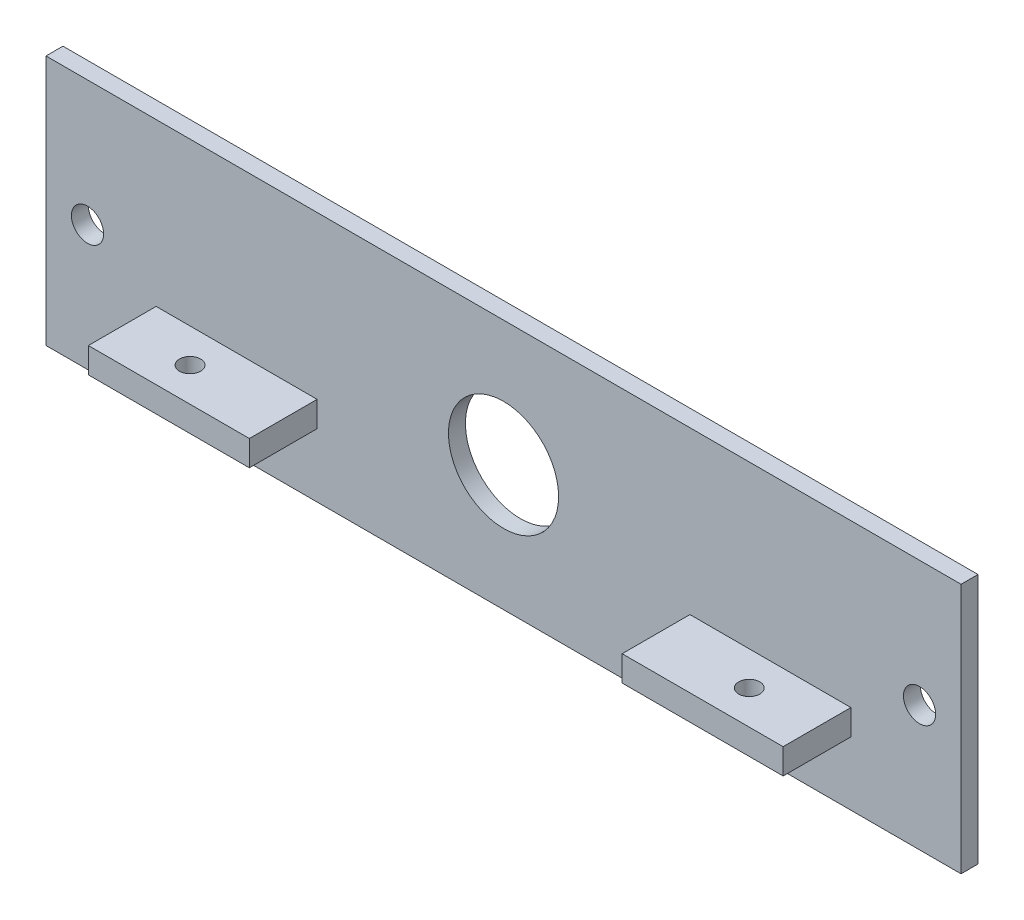
ISO-10303-21;
HEADER;
FILE_DESCRIPTION(('STEP AP214'),'2;1');
FILE_NAME('part.step','',(''),(''),'','','');
FILE_SCHEMA(('AUTOMOTIVE_DESIGN { 1 0 10303 214 1 1 1 1 }'));
ENDSEC;
DATA;
#1=APPLICATION_CONTEXT('core data for automotive mechanical design processes');
#2=APPLICATION_PROTOCOL_DEFINITION('international standard','automotive_design',2000,#1);
#3=PRODUCT_CONTEXT('',#1,'mechanical');
#4=PRODUCT('Part','Part','',(#3));
#5=PRODUCT_RELATED_PRODUCT_CATEGORY('part','',(#4));
#6=PRODUCT_DEFINITION_FORMATION('','',#4);
#7=PRODUCT_DEFINITION_CONTEXT('part definition',#1,'design');
#8=PRODUCT_DEFINITION('design','',#6,#7);
#9=PRODUCT_DEFINITION_SHAPE('','',#8);
#10=(LENGTH_UNIT() NAMED_UNIT(*) SI_UNIT(.MILLI.,.METRE.));
#11=(NAMED_UNIT(*) PLANE_ANGLE_UNIT() SI_UNIT($,.RADIAN.));
#12=(NAMED_UNIT(*) SI_UNIT($,.STERADIAN.) SOLID_ANGLE_UNIT());
#13=UNCERTAINTY_MEASURE_WITH_UNIT(LENGTH_MEASURE(1.E-05),#10,'distance_accuracy_value','');
#14=(GEOMETRIC_REPRESENTATION_CONTEXT(3) GLOBAL_UNCERTAINTY_ASSIGNED_CONTEXT((#13)) GLOBAL_UNIT_ASSIGNED_CONTEXT((#10,
#11,#12)) REPRESENTATION_CONTEXT('',''));
#15=CARTESIAN_POINT('',(0.,0.,0.));
#16=DIRECTION('',(0.,0.,1.));
#17=DIRECTION('',(1.,0.,0.));
#18=AXIS2_PLACEMENT_3D('',#15,#16,#17);
#19=CARTESIAN_POINT('',(54.,-14.8,-10.));
#20=DIRECTION('',(1.,0.,0.));
#21=DIRECTION('',(0.,0.,-1.));
#22=AXIS2_PLACEMENT_3D('',#19,#20,#21);
#23=PLANE('',#22);
#24=DIRECTION('',(0.,0.,1.));
#25=VECTOR('',#24,1.);
#26=CARTESIAN_POINT('',(54.,14.8,-10.));
#27=LINE('',#26,#25);
#28=CARTESIAN_POINT('',(54.,14.8,-10.));
#29=VERTEX_POINT('',#28);
#30=CARTESIAN_POINT('',(54.,14.8,-8.));
#31=VERTEX_POINT('',#30);
#32=EDGE_CURVE('E238',#29,#31,#27,.T.);
#33=ORIENTED_EDGE('',*,*,#32,.T.);
#34=DIRECTION('',(0.,-1.,0.));
#35=VECTOR('',#34,1.);
#36=CARTESIAN_POINT('',(54.,-14.8,-8.));
#37=LINE('',#36,#35);
#38=CARTESIAN_POINT('',(54.,-14.8,-8.));
#39=VERTEX_POINT('',#38);
#40=EDGE_CURVE('E51',#31,#39,#37,.T.);
#41=ORIENTED_EDGE('',*,*,#40,.T.);
#42=DIRECTION('',(0.,0.,1.));
#43=VECTOR('',#42,1.);
#44=CARTESIAN_POINT('',(54.,-14.8,-10.));
#45=LINE('',#44,#43);
#46=CARTESIAN_POINT('',(54.,-14.8,-10.));
#47=VERTEX_POINT('',#46);
#48=EDGE_CURVE('E12',#47,#39,#45,.T.);
#49=ORIENTED_EDGE('',*,*,#48,.F.);
#50=DIRECTION('',(0.,1.,0.));
#51=VECTOR('',#50,1.);
#52=CARTESIAN_POINT('',(54.,-14.8,-10.));
#53=LINE('',#52,#51);
#54=EDGE_CURVE('E227',#47,#29,#53,.T.);
#55=ORIENTED_EDGE('',*,*,#54,.T.);
#56=EDGE_LOOP('',(#33,#41,#49,#55));
#57=FACE_BOUND('',#56,.T.);
#58=ADVANCED_FACE('F35',(#57),#23,.T.);
#59=CARTESIAN_POINT('',(-54.,-14.8,-10.));
#60=DIRECTION('',(0.,-1.,0.));
#61=DIRECTION('',(0.,0.,-1.));
#62=AXIS2_PLACEMENT_3D('',#59,#60,#61);
#63=PLANE('',#62);
#64=ORIENTED_EDGE('',*,*,#48,.T.);
#65=DIRECTION('',(-1.,0.,0.));
#66=VECTOR('',#65,1.);
#67=CARTESIAN_POINT('',(-54.,-14.8,-8.));
#68=LINE('',#67,#66);
#69=CARTESIAN_POINT('',(-54.,-14.8,-8.));
#70=VERTEX_POINT('',#69);
#71=EDGE_CURVE('E214',#39,#70,#68,.T.);
#72=ORIENTED_EDGE('',*,*,#71,.T.);
#73=DIRECTION('',(0.,0.,1.));
#74=VECTOR('',#73,1.);
#75=CARTESIAN_POINT('',(-54.,-14.8,-10.));
#76=LINE('',#75,#74);
#77=CARTESIAN_POINT('',(-54.,-14.8,-10.));
#78=VERTEX_POINT('',#77);
#79=EDGE_CURVE('E43',#78,#70,#76,.T.);
#80=ORIENTED_EDGE('',*,*,#79,.F.);
#81=DIRECTION('',(1.,0.,0.));
#82=VECTOR('',#81,1.);
#83=CARTESIAN_POINT('',(-54.,-14.8,-10.));
#84=LINE('',#83,#82);
#85=EDGE_CURVE('E236',#78,#47,#84,.T.);
#86=ORIENTED_EDGE('',*,*,#85,.T.);
#87=EDGE_LOOP('',(#64,#72,#80,#86));
#88=FACE_BOUND('',#87,.T.);
#89=ADVANCED_FACE('F258',(#88),#63,.T.);
#90=CARTESIAN_POINT('',(-54.,-14.8,-10.));
#91=DIRECTION('',(-1.,0.,0.));
#92=DIRECTION('',(0.,0.,1.));
#93=AXIS2_PLACEMENT_3D('',#90,#91,#92);
#94=PLANE('',#93);
#95=ORIENTED_EDGE('',*,*,#79,.T.);
#96=DIRECTION('',(0.,1.,0.));
#97=VECTOR('',#96,1.);
#98=CARTESIAN_POINT('',(-54.,-14.8,-8.));
#99=LINE('',#98,#97);
#100=CARTESIAN_POINT('',(-54.,14.8,-8.));
#101=VERTEX_POINT('',#100);
#102=EDGE_CURVE('E211',#70,#101,#99,.T.);
#103=ORIENTED_EDGE('',*,*,#102,.T.);
#104=DIRECTION('',(0.,0.,1.));
#105=VECTOR('',#104,1.);
#106=CARTESIAN_POINT('',(-54.,14.8,-10.));
#107=LINE('',#106,#105);
#108=CARTESIAN_POINT('',(-54.,14.8,-10.));
#109=VERTEX_POINT('',#108);
#110=EDGE_CURVE('E242',#109,#101,#107,.T.);
#111=ORIENTED_EDGE('',*,*,#110,.F.);
#112=DIRECTION('',(0.,-1.,0.));
#113=VECTOR('',#112,1.);
#114=CARTESIAN_POINT('',(-54.,-14.8,-10.));
#115=LINE('',#114,#113);
#116=EDGE_CURVE('E233',#109,#78,#115,.T.);
#117=ORIENTED_EDGE('',*,*,#116,.T.);
#118=EDGE_LOOP('',(#95,#103,#111,#117));
#119=FACE_BOUND('',#118,.T.);
#120=ADVANCED_FACE('F255',(#119),#94,.T.);
#121=CARTESIAN_POINT('',(-54.,14.8,-10.));
#122=DIRECTION('',(0.,1.,0.));
#123=DIRECTION('',(0.,0.,1.));
#124=AXIS2_PLACEMENT_3D('',#121,#122,#123);
#125=PLANE('',#124);
#126=ORIENTED_EDGE('',*,*,#110,.T.);
#127=DIRECTION('',(1.,0.,0.));
#128=VECTOR('',#127,1.);
#129=CARTESIAN_POINT('',(-54.,14.8,-8.));
#130=LINE('',#129,#128);
#131=EDGE_CURVE('E209',#101,#31,#130,.T.);
#132=ORIENTED_EDGE('',*,*,#131,.T.);
#133=ORIENTED_EDGE('',*,*,#32,.F.);
#134=DIRECTION('',(-1.,0.,0.));
#135=VECTOR('',#134,1.);
#136=CARTESIAN_POINT('',(-54.,14.8,-10.));
#137=LINE('',#136,#135);
#138=EDGE_CURVE('E230',#29,#109,#137,.T.);
#139=ORIENTED_EDGE('',*,*,#138,.T.);
#140=EDGE_LOOP('',(#126,#132,#133,#139));
#141=FACE_BOUND('',#140,.T.);
#142=ADVANCED_FACE('F249',(#141),#125,.T.);
#143=CARTESIAN_POINT('',(-49.1,0.,-10.));
#144=DIRECTION('',(0.,0.,1.));
#145=DIRECTION('',(1.,0.,0.));
#146=AXIS2_PLACEMENT_3D('',#143,#144,#145);
#147=CYLINDRICAL_SURFACE('',#146,1.9);
#148=CARTESIAN_POINT('',(-49.1,0.,-10.));
#149=DIRECTION('',(0.,0.,1.));
#150=DIRECTION('',(1.,0.,0.));
#151=AXIS2_PLACEMENT_3D('',#148,#149,#150);
#152=CIRCLE('',#151,1.9);
#153=CARTESIAN_POINT('',(-47.2,0.,-10.));
#154=VERTEX_POINT('',#153);
#155=EDGE_CURVE('E224',#154,#154,#152,.T.);
#156=ORIENTED_EDGE('',*,*,#155,.F.);
#157=EDGE_LOOP('',(#156));
#158=FACE_BOUND('',#157,.T.);
#159=CARTESIAN_POINT('',(-49.1,0.,-8.));
#160=DIRECTION('',(0.,0.,1.));
#161=DIRECTION('',(1.,0.,0.));
#162=AXIS2_PLACEMENT_3D('',#159,#160,#161);
#163=CIRCLE('',#162,1.9);
#164=CARTESIAN_POINT('',(-47.2,0.,-8.));
#165=VERTEX_POINT('',#164);
#166=EDGE_CURVE('E206',#165,#165,#163,.F.);
#167=ORIENTED_EDGE('',*,*,#166,.F.);
#168=EDGE_LOOP('',(#167));
#169=FACE_BOUND('',#168,.T.);
#170=ADVANCED_FACE('F270',(#158,#169),#147,.F.);
#171=CARTESIAN_POINT('',(49.1,0.,-10.));
#172=DIRECTION('',(0.,0.,1.));
#173=DIRECTION('',(1.,0.,0.));
#174=AXIS2_PLACEMENT_3D('',#171,#172,#173);
#175=CYLINDRICAL_SURFACE('',#174,1.9);
#176=CARTESIAN_POINT('',(49.1,0.,-10.));
#177=DIRECTION('',(0.,0.,1.));
#178=DIRECTION('',(1.,0.,0.));
#179=AXIS2_PLACEMENT_3D('',#176,#177,#178);
#180=CIRCLE('',#179,1.9);
#181=CARTESIAN_POINT('',(51.,0.,-10.));
#182=VERTEX_POINT('',#181);
#183=EDGE_CURVE('E221',#182,#182,#180,.T.);
#184=ORIENTED_EDGE('',*,*,#183,.F.);
#185=EDGE_LOOP('',(#184));
#186=FACE_BOUND('',#185,.T.);
#187=CARTESIAN_POINT('',(49.1,0.,-8.));
#188=DIRECTION('',(0.,0.,1.));
#189=DIRECTION('',(1.,0.,0.));
#190=AXIS2_PLACEMENT_3D('',#187,#188,#189);
#191=CIRCLE('',#190,1.9);
#192=CARTESIAN_POINT('',(51.,0.,-8.));
#193=VERTEX_POINT('',#192);
#194=EDGE_CURVE('E203',#193,#193,#191,.F.);
#195=ORIENTED_EDGE('',*,*,#194,.F.);
#196=EDGE_LOOP('',(#195));
#197=FACE_BOUND('',#196,.T.);
#198=ADVANCED_FACE('F274',(#186,#197),#175,.F.);
#199=CARTESIAN_POINT('',(0.,0.,-10.));
#200=DIRECTION('',(0.,0.,1.));
#201=DIRECTION('',(1.,0.,0.));
#202=AXIS2_PLACEMENT_3D('',#199,#200,#201);
#203=CYLINDRICAL_SURFACE('',#202,6.5);
#204=CARTESIAN_POINT('',(0.,0.,-10.));
#205=DIRECTION('',(0.,0.,1.));
#206=DIRECTION('',(1.,0.,0.));
#207=AXIS2_PLACEMENT_3D('',#204,#205,#206);
#208=CIRCLE('',#207,6.5);
#209=CARTESIAN_POINT('',(6.5,0.,-10.));
#210=VERTEX_POINT('',#209);
#211=EDGE_CURVE('E218',#210,#210,#208,.T.);
#212=ORIENTED_EDGE('',*,*,#211,.F.);
#213=EDGE_LOOP('',(#212));
#214=FACE_BOUND('',#213,.T.);
#215=CARTESIAN_POINT('',(0.,0.,-8.));
#216=DIRECTION('',(0.,0.,1.));
#217=DIRECTION('',(1.,0.,0.));
#218=AXIS2_PLACEMENT_3D('',#215,#216,#217);
#219=CIRCLE('',#218,6.5);
#220=CARTESIAN_POINT('',(6.5,0.,-8.));
#221=VERTEX_POINT('',#220);
#222=EDGE_CURVE('E38',#221,#221,#219,.F.);
#223=ORIENTED_EDGE('',*,*,#222,.F.);
#224=EDGE_LOOP('',(#223));
#225=FACE_BOUND('',#224,.T.);
#226=ADVANCED_FACE('F280',(#214,#225),#203,.F.);
#227=CARTESIAN_POINT('',(54.,14.8,-10.));
#228=DIRECTION('',(0.,0.,-1.));
#229=DIRECTION('',(-1.,0.,0.));
#230=AXIS2_PLACEMENT_3D('',#227,#228,#229);
#231=PLANE('',#230);
#232=ORIENTED_EDGE('',*,*,#211,.T.);
#233=EDGE_LOOP('',(#232));
#234=FACE_BOUND('',#233,.T.);
#235=ORIENTED_EDGE('',*,*,#183,.T.);
#236=EDGE_LOOP('',(#235));
#237=FACE_BOUND('',#236,.T.);
#238=ORIENTED_EDGE('',*,*,#155,.T.);
#239=EDGE_LOOP('',(#238));
#240=FACE_BOUND('',#239,.T.);
#241=ORIENTED_EDGE('',*,*,#54,.F.);
#242=ORIENTED_EDGE('',*,*,#85,.F.);
#243=ORIENTED_EDGE('',*,*,#116,.F.);
#244=ORIENTED_EDGE('',*,*,#138,.F.);
#245=EDGE_LOOP('',(#241,#242,#243,#244));
#246=FACE_BOUND('',#245,.T.);
#247=ADVANCED_FACE('F252',(#234,#237,#240,#246),#231,.T.);
#248=CARTESIAN_POINT('',(0.,0.,-8.));
#249=DIRECTION('',(0.,0.,1.));
#250=DIRECTION('',(1.,0.,0.));
#251=AXIS2_PLACEMENT_3D('',#248,#249,#250);
#252=PLANE('',#251);
#253=ORIENTED_EDGE('',*,*,#131,.F.);
#254=ORIENTED_EDGE('',*,*,#102,.F.);
#255=ORIENTED_EDGE('',*,*,#71,.F.);
#256=ORIENTED_EDGE('',*,*,#40,.F.);
#257=EDGE_LOOP('',(#253,#254,#255,#256));
#258=FACE_BOUND('',#257,.T.);
#259=ORIENTED_EDGE('',*,*,#194,.T.);
#260=EDGE_LOOP('',(#259));
#261=FACE_BOUND('',#260,.T.);
#262=DIRECTION('',(1.,0.,0.));
#263=VECTOR('',#262,1.);
#264=CARTESIAN_POINT('',(41.,-7.3,-8.));
#265=LINE('',#264,#263);
#266=CARTESIAN_POINT('',(22.,-7.3,-8.));
#267=VERTEX_POINT('',#266);
#268=CARTESIAN_POINT('',(41.,-7.3,-8.));
#269=VERTEX_POINT('',#268);
#270=EDGE_CURVE('E184',#267,#269,#265,.T.);
#271=ORIENTED_EDGE('',*,*,#270,.F.);
#272=DIRECTION('',(0.,-1.,0.));
#273=VECTOR('',#272,1.);
#274=CARTESIAN_POINT('',(22.,-7.3,-8.));
#275=LINE('',#274,#273);
#276=CARTESIAN_POINT('',(22.,-4.3,-8.));
#277=VERTEX_POINT('',#276);
#278=EDGE_CURVE('E181',#277,#267,#275,.T.);
#279=ORIENTED_EDGE('',*,*,#278,.F.);
#280=DIRECTION('',(-1.,0.,0.));
#281=VECTOR('',#280,1.);
#282=CARTESIAN_POINT('',(41.,-4.3,-8.));
#283=LINE('',#282,#281);
#284=CARTESIAN_POINT('',(41.,-4.3,-8.));
#285=VERTEX_POINT('',#284);
#286=EDGE_CURVE('E177',#285,#277,#283,.T.);
#287=ORIENTED_EDGE('',*,*,#286,.F.);
#288=DIRECTION('',(0.,1.,0.));
#289=VECTOR('',#288,1.);
#290=CARTESIAN_POINT('',(41.,-7.3,-8.));
#291=LINE('',#290,#289);
#292=EDGE_CURVE('E174',#269,#285,#291,.T.);
#293=ORIENTED_EDGE('',*,*,#292,.F.);
#294=EDGE_LOOP('',(#271,#279,#287,#293));
#295=FACE_BOUND('',#294,.T.);
#296=DIRECTION('',(-1.,0.,0.));
#297=VECTOR('',#296,1.);
#298=CARTESIAN_POINT('',(-41.,-4.3,-8.));
#299=LINE('',#298,#297);
#300=CARTESIAN_POINT('',(-22.,-4.3,-8.));
#301=VERTEX_POINT('',#300);
#302=CARTESIAN_POINT('',(-41.,-4.3,-8.));
#303=VERTEX_POINT('',#302);
#304=EDGE_CURVE('E138',#301,#303,#299,.T.);
#305=ORIENTED_EDGE('',*,*,#304,.F.);
#306=DIRECTION('',(0.,1.,0.));
#307=VECTOR('',#306,1.);
#308=CARTESIAN_POINT('',(-22.,-4.3,-8.));
#309=LINE('',#308,#307);
#310=CARTESIAN_POINT('',(-22.,-7.3,-8.));
#311=VERTEX_POINT('',#310);
#312=EDGE_CURVE('E148',#311,#301,#309,.T.);
#313=ORIENTED_EDGE('',*,*,#312,.F.);
#314=DIRECTION('',(1.,0.,0.));
#315=VECTOR('',#314,1.);
#316=CARTESIAN_POINT('',(-41.,-7.3,-8.));
#317=LINE('',#316,#315);
#318=CARTESIAN_POINT('',(-41.,-7.3,-8.));
#319=VERTEX_POINT('',#318);
#320=EDGE_CURVE('E130',#319,#311,#317,.T.);
#321=ORIENTED_EDGE('',*,*,#320,.F.);
#322=DIRECTION('',(0.,-1.,0.));
#323=VECTOR('',#322,1.);
#324=CARTESIAN_POINT('',(-41.,-4.3,-8.));
#325=LINE('',#324,#323);
#326=EDGE_CURVE('E145',#303,#319,#325,.T.);
#327=ORIENTED_EDGE('',*,*,#326,.F.);
#328=EDGE_LOOP('',(#305,#313,#321,#327));
#329=FACE_BOUND('',#328,.T.);
#330=ORIENTED_EDGE('',*,*,#222,.T.);
#331=EDGE_LOOP('',(#330));
#332=FACE_BOUND('',#331,.T.);
#333=ORIENTED_EDGE('',*,*,#166,.T.);
#334=EDGE_LOOP('',(#333));
#335=FACE_BOUND('',#334,.T.);
#336=ADVANCED_FACE('F143',(#258,#261,#295,#329,#332,#335),#252,.T.);
#337=CARTESIAN_POINT('',(41.,-7.3,-8.));
#338=DIRECTION('',(1.,0.,0.));
#339=DIRECTION('',(0.,0.,-1.));
#340=AXIS2_PLACEMENT_3D('',#337,#338,#339);
#341=PLANE('',#340);
#342=DIRECTION('',(0.,1.,0.));
#343=VECTOR('',#342,1.);
#344=CARTESIAN_POINT('',(41.,-7.3,0.));
#345=LINE('',#344,#343);
#346=CARTESIAN_POINT('',(41.,-7.3,0.));
#347=VERTEX_POINT('',#346);
#348=CARTESIAN_POINT('',(41.,-4.3,0.));
#349=VERTEX_POINT('',#348);
#350=EDGE_CURVE('E170',#347,#349,#345,.T.);
#351=ORIENTED_EDGE('',*,*,#350,.F.);
#352=DIRECTION('',(0.,0.,1.));
#353=VECTOR('',#352,1.);
#354=CARTESIAN_POINT('',(41.,-7.3,-8.));
#355=LINE('',#354,#353);
#356=EDGE_CURVE('E196',#269,#347,#355,.T.);
#357=ORIENTED_EDGE('',*,*,#356,.F.);
#358=ORIENTED_EDGE('',*,*,#292,.T.);
#359=DIRECTION('',(0.,0.,1.));
#360=VECTOR('',#359,1.);
#361=CARTESIAN_POINT('',(41.,-4.3,-8.));
#362=LINE('',#361,#360);
#363=EDGE_CURVE('E187',#285,#349,#362,.T.);
#364=ORIENTED_EDGE('',*,*,#363,.T.);
#365=EDGE_LOOP('',(#351,#357,#358,#364));
#366=FACE_BOUND('',#365,.T.);
#367=ADVANCED_FACE('F292',(#366),#341,.T.);
#368=CARTESIAN_POINT('',(41.,-7.3,-8.));
#369=DIRECTION('',(0.,-1.,0.));
#370=DIRECTION('',(1.,0.,0.));
#371=AXIS2_PLACEMENT_3D('',#368,#369,#370);
#372=PLANE('',#371);
#373=CARTESIAN_POINT('',(33.,-7.3,-4.));
#374=DIRECTION('',(0.,-1.,0.));
#375=DIRECTION('',(1.,0.,0.));
#376=AXIS2_PLACEMENT_3D('',#373,#374,#375);
#377=CIRCLE('',#376,1.24999999999999);
#378=CARTESIAN_POINT('',(34.25,-7.3,-4.));
#379=VERTEX_POINT('',#378);
#380=EDGE_CURVE('E410',#379,#379,#377,.T.);
#381=ORIENTED_EDGE('',*,*,#380,.F.);
#382=EDGE_LOOP('',(#381));
#383=FACE_BOUND('',#382,.T.);
#384=DIRECTION('',(1.,0.,0.));
#385=VECTOR('',#384,1.);
#386=CARTESIAN_POINT('',(41.,-7.3,0.));
#387=LINE('',#386,#385);
#388=CARTESIAN_POINT('',(22.,-7.3,0.));
#389=VERTEX_POINT('',#388);
#390=EDGE_CURVE('E178',#389,#347,#387,.T.);
#391=ORIENTED_EDGE('',*,*,#390,.F.);
#392=DIRECTION('',(0.,0.,1.));
#393=VECTOR('',#392,1.);
#394=CARTESIAN_POINT('',(22.,-7.3,-8.));
#395=LINE('',#394,#393);
#396=EDGE_CURVE('E198',#267,#389,#395,.T.);
#397=ORIENTED_EDGE('',*,*,#396,.F.);
#398=ORIENTED_EDGE('',*,*,#270,.T.);
#399=ORIENTED_EDGE('',*,*,#356,.T.);
#400=EDGE_LOOP('',(#391,#397,#398,#399));
#401=FACE_BOUND('',#400,.T.);
#402=ADVANCED_FACE('F313',(#383,#401),#372,.T.);
#403=CARTESIAN_POINT('',(22.,-7.3,-8.));
#404=DIRECTION('',(-1.,0.,0.));
#405=DIRECTION('',(0.,0.,1.));
#406=AXIS2_PLACEMENT_3D('',#403,#404,#405);
#407=PLANE('',#406);
#408=DIRECTION('',(0.,-1.,0.));
#409=VECTOR('',#408,1.);
#410=CARTESIAN_POINT('',(22.,-7.3,0.));
#411=LINE('',#410,#409);
#412=CARTESIAN_POINT('',(22.,-4.3,0.));
#413=VERTEX_POINT('',#412);
#414=EDGE_CURVE('E59',#413,#389,#411,.T.);
#415=ORIENTED_EDGE('',*,*,#414,.F.);
#416=DIRECTION('',(0.,0.,1.));
#417=VECTOR('',#416,1.);
#418=CARTESIAN_POINT('',(22.,-4.3,-8.));
#419=LINE('',#418,#417);
#420=EDGE_CURVE('E200',#277,#413,#419,.T.);
#421=ORIENTED_EDGE('',*,*,#420,.F.);
#422=ORIENTED_EDGE('',*,*,#278,.T.);
#423=ORIENTED_EDGE('',*,*,#396,.T.);
#424=EDGE_LOOP('',(#415,#421,#422,#423));
#425=FACE_BOUND('',#424,.T.);
#426=ADVANCED_FACE('F306',(#425),#407,.T.);
#427=CARTESIAN_POINT('',(41.,-4.3,-8.));
#428=DIRECTION('',(0.,1.,0.));
#429=DIRECTION('',(-1.,0.,0.));
#430=AXIS2_PLACEMENT_3D('',#427,#428,#429);
#431=PLANE('',#430);
#432=CARTESIAN_POINT('',(33.,-4.3,-4.));
#433=DIRECTION('',(0.,1.,0.));
#434=DIRECTION('',(0.,0.,1.));
#435=AXIS2_PLACEMENT_3D('',#432,#433,#434);
#436=CIRCLE('',#435,1.24999999999999);
#437=CARTESIAN_POINT('',(33.,-4.3,-2.75000000000001));
#438=VERTEX_POINT('',#437);
#439=EDGE_CURVE('E413',#438,#438,#436,.T.);
#440=ORIENTED_EDGE('',*,*,#439,.F.);
#441=EDGE_LOOP('',(#440));
#442=FACE_BOUND('',#441,.T.);
#443=DIRECTION('',(-1.,0.,0.));
#444=VECTOR('',#443,1.);
#445=CARTESIAN_POINT('',(41.,-4.3,0.));
#446=LINE('',#445,#444);
#447=EDGE_CURVE('E190',#349,#413,#446,.T.);
#448=ORIENTED_EDGE('',*,*,#447,.F.);
#449=ORIENTED_EDGE('',*,*,#363,.F.);
#450=ORIENTED_EDGE('',*,*,#286,.T.);
#451=ORIENTED_EDGE('',*,*,#420,.T.);
#452=EDGE_LOOP('',(#448,#449,#450,#451));
#453=FACE_BOUND('',#452,.T.);
#454=ADVANCED_FACE('F310',(#442,#453),#431,.T.);
#455=CARTESIAN_POINT('',(-41.,-4.3,-8.));
#456=DIRECTION('',(-1.,0.,0.));
#457=DIRECTION('',(0.,0.,1.));
#458=AXIS2_PLACEMENT_3D('',#455,#456,#457);
#459=PLANE('',#458);
#460=DIRECTION('',(0.,-1.,0.));
#461=VECTOR('',#460,1.);
#462=CARTESIAN_POINT('',(-41.,-4.3,0.));
#463=LINE('',#462,#461);
#464=CARTESIAN_POINT('',(-41.,-4.3,0.));
#465=VERTEX_POINT('',#464);
#466=CARTESIAN_POINT('',(-41.,-7.3,0.));
#467=VERTEX_POINT('',#466);
#468=EDGE_CURVE('E164',#465,#467,#463,.T.);
#469=ORIENTED_EDGE('',*,*,#468,.F.);
#470=DIRECTION('',(0.,0.,1.));
#471=VECTOR('',#470,1.);
#472=CARTESIAN_POINT('',(-41.,-4.3,-8.));
#473=LINE('',#472,#471);
#474=EDGE_CURVE('E152',#303,#465,#473,.T.);
#475=ORIENTED_EDGE('',*,*,#474,.F.);
#476=ORIENTED_EDGE('',*,*,#326,.T.);
#477=DIRECTION('',(0.,0.,1.));
#478=VECTOR('',#477,1.);
#479=CARTESIAN_POINT('',(-41.,-7.3,-8.));
#480=LINE('',#479,#478);
#481=EDGE_CURVE('E126',#319,#467,#480,.T.);
#482=ORIENTED_EDGE('',*,*,#481,.T.);
#483=EDGE_LOOP('',(#469,#475,#476,#482));
#484=FACE_BOUND('',#483,.T.);
#485=ADVANCED_FACE('F151',(#484),#459,.T.);
#486=CARTESIAN_POINT('',(-41.,-4.3,-8.));
#487=DIRECTION('',(0.,1.,0.));
#488=DIRECTION('',(0.,0.,1.));
#489=AXIS2_PLACEMENT_3D('',#486,#487,#488);
#490=PLANE('',#489);
#491=CARTESIAN_POINT('',(-33.,-4.3,-4.));
#492=DIRECTION('',(0.,1.,0.));
#493=DIRECTION('',(0.,0.,1.));
#494=AXIS2_PLACEMENT_3D('',#491,#492,#493);
#495=CIRCLE('',#494,1.24999999999999);
#496=CARTESIAN_POINT('',(-33.,-4.3,-2.75000000000001));
#497=VERTEX_POINT('',#496);
#498=EDGE_CURVE('E415',#497,#497,#495,.T.);
#499=ORIENTED_EDGE('',*,*,#498,.F.);
#500=EDGE_LOOP('',(#499));
#501=FACE_BOUND('',#500,.T.);
#502=DIRECTION('',(-1.,0.,0.));
#503=VECTOR('',#502,1.);
#504=CARTESIAN_POINT('',(-41.,-4.3,0.));
#505=LINE('',#504,#503);
#506=CARTESIAN_POINT('',(-22.,-4.3,0.));
#507=VERTEX_POINT('',#506);
#508=EDGE_CURVE('E153',#507,#465,#505,.T.);
#509=ORIENTED_EDGE('',*,*,#508,.F.);
#510=DIRECTION('',(0.,0.,1.));
#511=VECTOR('',#510,1.);
#512=CARTESIAN_POINT('',(-22.,-4.3,-8.));
#513=LINE('',#512,#511);
#514=EDGE_CURVE('E171',#301,#507,#513,.T.);
#515=ORIENTED_EDGE('',*,*,#514,.F.);
#516=ORIENTED_EDGE('',*,*,#304,.T.);
#517=ORIENTED_EDGE('',*,*,#474,.T.);
#518=EDGE_LOOP('',(#509,#515,#516,#517));
#519=FACE_BOUND('',#518,.T.);
#520=ADVANCED_FACE('F334',(#501,#519),#490,.T.);
#521=CARTESIAN_POINT('',(-22.,-4.3,-8.));
#522=DIRECTION('',(1.,0.,0.));
#523=DIRECTION('',(0.,0.,-1.));
#524=AXIS2_PLACEMENT_3D('',#521,#522,#523);
#525=PLANE('',#524);
#526=DIRECTION('',(0.,1.,0.));
#527=VECTOR('',#526,1.);
#528=CARTESIAN_POINT('',(-22.,-4.3,0.));
#529=LINE('',#528,#527);
#530=CARTESIAN_POINT('',(-22.,-7.3,0.));
#531=VERTEX_POINT('',#530);
#532=EDGE_CURVE('E156',#531,#507,#529,.T.);
#533=ORIENTED_EDGE('',*,*,#532,.F.);
#534=DIRECTION('',(0.,0.,1.));
#535=VECTOR('',#534,1.);
#536=CARTESIAN_POINT('',(-22.,-7.3,-8.));
#537=LINE('',#536,#535);
#538=EDGE_CURVE('E137',#311,#531,#537,.T.);
#539=ORIENTED_EDGE('',*,*,#538,.F.);
#540=ORIENTED_EDGE('',*,*,#312,.T.);
#541=ORIENTED_EDGE('',*,*,#514,.T.);
#542=EDGE_LOOP('',(#533,#539,#540,#541));
#543=FACE_BOUND('',#542,.T.);
#544=ADVANCED_FACE('F329',(#543),#525,.T.);
#545=CARTESIAN_POINT('',(-41.,-7.3,-8.));
#546=DIRECTION('',(0.,-1.,0.));
#547=DIRECTION('',(0.,0.,-1.));
#548=AXIS2_PLACEMENT_3D('',#545,#546,#547);
#549=PLANE('',#548);
#550=CARTESIAN_POINT('',(-33.,-7.3,-4.));
#551=DIRECTION('',(0.,-1.,0.));
#552=DIRECTION('',(0.,0.,-1.));
#553=AXIS2_PLACEMENT_3D('',#550,#551,#552);
#554=CIRCLE('',#553,1.24999999999999);
#555=CARTESIAN_POINT('',(-33.,-7.3,-5.24999999999999));
#556=VERTEX_POINT('',#555);
#557=EDGE_CURVE('E159',#556,#556,#554,.T.);
#558=ORIENTED_EDGE('',*,*,#557,.F.);
#559=EDGE_LOOP('',(#558));
#560=FACE_BOUND('',#559,.T.);
#561=DIRECTION('',(1.,0.,0.));
#562=VECTOR('',#561,1.);
#563=CARTESIAN_POINT('',(-41.,-7.3,0.));
#564=LINE('',#563,#562);
#565=EDGE_CURVE('E132',#467,#531,#564,.T.);
#566=ORIENTED_EDGE('',*,*,#565,.F.);
#567=ORIENTED_EDGE('',*,*,#481,.F.);
#568=ORIENTED_EDGE('',*,*,#320,.T.);
#569=ORIENTED_EDGE('',*,*,#538,.T.);
#570=EDGE_LOOP('',(#566,#567,#568,#569));
#571=FACE_BOUND('',#570,.T.);
#572=ADVANCED_FACE('F128',(#560,#571),#549,.T.);
#573=CARTESIAN_POINT('',(54.,14.8,0.));
#574=DIRECTION('',(0.,0.,-1.));
#575=DIRECTION('',(-1.,0.,0.));
#576=AXIS2_PLACEMENT_3D('',#573,#574,#575);
#577=PLANE('',#576);
#578=ORIENTED_EDGE('',*,*,#468,.T.);
#579=ORIENTED_EDGE('',*,*,#565,.T.);
#580=ORIENTED_EDGE('',*,*,#532,.T.);
#581=ORIENTED_EDGE('',*,*,#508,.T.);
#582=EDGE_LOOP('',(#578,#579,#580,#581));
#583=FACE_BOUND('',#582,.T.);
#584=ADVANCED_FACE('F317',(#583),#577,.F.);
#585=ORIENTED_EDGE('',*,*,#350,.T.);
#586=ORIENTED_EDGE('',*,*,#447,.T.);
#587=ORIENTED_EDGE('',*,*,#414,.T.);
#588=ORIENTED_EDGE('',*,*,#390,.T.);
#589=EDGE_LOOP('',(#585,#586,#587,#588));
#590=FACE_BOUND('',#589,.T.);
#591=ADVANCED_FACE('F267',(#590),#577,.F.);
#592=CARTESIAN_POINT('',(-33.,-4.3,-4.));
#593=DIRECTION('',(0.,1.,0.));
#594=DIRECTION('',(0.,0.,1.));
#595=AXIS2_PLACEMENT_3D('',#592,#593,#594);
#596=CYLINDRICAL_SURFACE('',#595,1.24999999999999);
#597=ORIENTED_EDGE('',*,*,#557,.T.);
#598=EDGE_LOOP('',(#597));
#599=FACE_BOUND('',#598,.T.);
#600=ORIENTED_EDGE('',*,*,#498,.T.);
#601=EDGE_LOOP('',(#600));
#602=FACE_BOUND('',#601,.T.);
#603=ADVANCED_FACE('F316',(#599,#602),#596,.F.);
#604=CARTESIAN_POINT('',(33.,-4.3,-4.));
#605=DIRECTION('',(0.,1.,0.));
#606=DIRECTION('',(0.,0.,1.));
#607=AXIS2_PLACEMENT_3D('',#604,#605,#606);
#608=CYLINDRICAL_SURFACE('',#607,1.24999999999999);
#609=ORIENTED_EDGE('',*,*,#380,.T.);
#610=EDGE_LOOP('',(#609));
#611=FACE_BOUND('',#610,.T.);
#612=ORIENTED_EDGE('',*,*,#439,.T.);
#613=EDGE_LOOP('',(#612));
#614=FACE_BOUND('',#613,.T.);
#615=ADVANCED_FACE('F322',(#611,#614),#608,.F.);
#616=CLOSED_SHELL('',(#58,#89,#120,#142,#170,#198,#226,#247,#336,#367,#402,#426,#454,#485,#520,
#544,#572,#584,#591,#603,#615));
#617=MANIFOLD_SOLID_BREP('B2',#616);
#618=ADVANCED_BREP_SHAPE_REPRESENTATION('',(#18,#617),#14);
#619=SHAPE_DEFINITION_REPRESENTATION(#9,#618);
ENDSEC;
END-ISO-10303-21;
